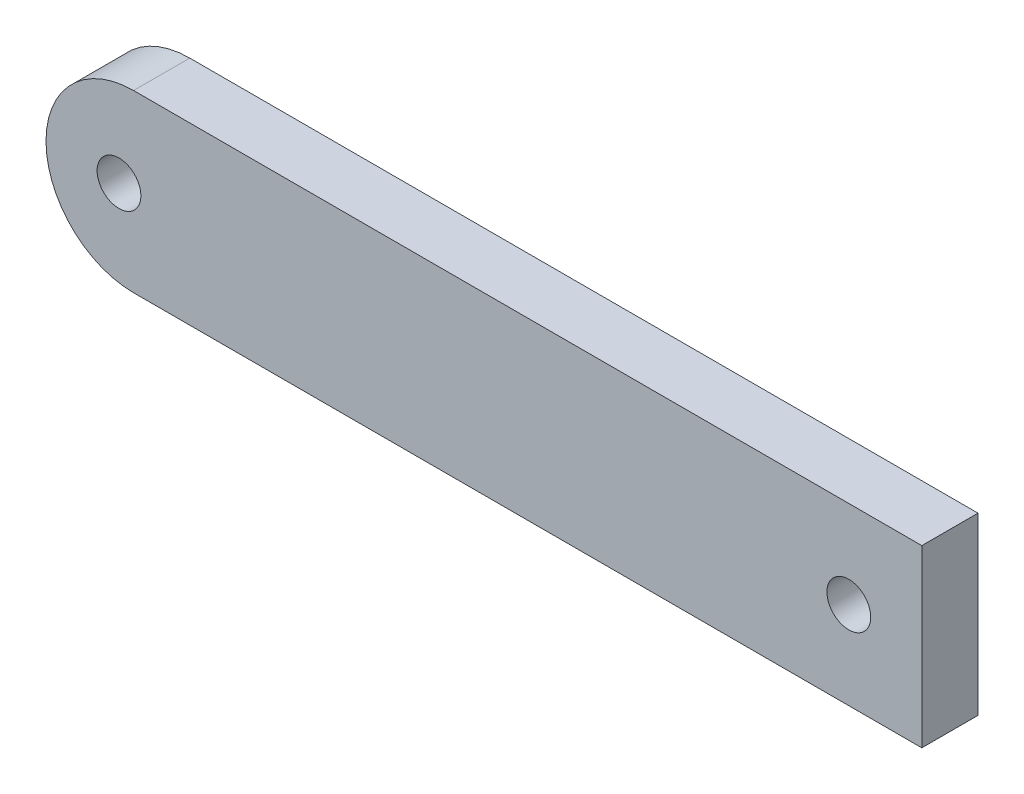
ISO-10303-21;
HEADER;
FILE_DESCRIPTION(('STEP AP214'),'2;1');
FILE_NAME('part.step','',(''),(''),'','','');
FILE_SCHEMA(('AUTOMOTIVE_DESIGN { 1 0 10303 214 1 1 1 1 }'));
ENDSEC;
DATA;
#1=APPLICATION_CONTEXT('core data for automotive mechanical design processes');
#2=APPLICATION_PROTOCOL_DEFINITION('international standard','automotive_design',2000,#1);
#3=PRODUCT_CONTEXT('',#1,'mechanical');
#4=PRODUCT('Part','Part','',(#3));
#5=PRODUCT_RELATED_PRODUCT_CATEGORY('part','',(#4));
#6=PRODUCT_DEFINITION_FORMATION('','',#4);
#7=PRODUCT_DEFINITION_CONTEXT('part definition',#1,'design');
#8=PRODUCT_DEFINITION('design','',#6,#7);
#9=PRODUCT_DEFINITION_SHAPE('','',#8);
#10=(LENGTH_UNIT() NAMED_UNIT(*) SI_UNIT(.MILLI.,.METRE.));
#11=(NAMED_UNIT(*) PLANE_ANGLE_UNIT() SI_UNIT($,.RADIAN.));
#12=(NAMED_UNIT(*) SI_UNIT($,.STERADIAN.) SOLID_ANGLE_UNIT());
#13=UNCERTAINTY_MEASURE_WITH_UNIT(LENGTH_MEASURE(1.E-05),#10,'distance_accuracy_value','');
#14=(GEOMETRIC_REPRESENTATION_CONTEXT(3) GLOBAL_UNCERTAINTY_ASSIGNED_CONTEXT((#13)) GLOBAL_UNIT_ASSIGNED_CONTEXT((#10,
#11,#12)) REPRESENTATION_CONTEXT('',''));
#15=CARTESIAN_POINT('',(0.,0.,0.));
#16=DIRECTION('',(0.,0.,1.));
#17=DIRECTION('',(1.,0.,0.));
#18=AXIS2_PLACEMENT_3D('',#15,#16,#17);
#19=CARTESIAN_POINT('',(0.,0.,3.85));
#20=DIRECTION('',(0.,0.,1.));
#21=DIRECTION('',(1.,0.,0.));
#22=AXIS2_PLACEMENT_3D('',#19,#20,#21);
#23=PLANE('',#22);
#24=CARTESIAN_POINT('',(-20.,0.,3.85));
#25=DIRECTION('',(0.,0.,1.));
#26=DIRECTION('',(1.,0.,0.));
#27=AXIS2_PLACEMENT_3D('',#24,#25,#26);
#28=CIRCLE('',#27,1.5);
#29=CARTESIAN_POINT('',(-21.5,0.,3.85));
#30=VERTEX_POINT('',#29);
#31=EDGE_CURVE('E128',#30,#30,#28,.T.);
#32=ORIENTED_EDGE('',*,*,#31,.F.);
#33=EDGE_LOOP('',(#32));
#34=FACE_BOUND('',#33,.T.);
#35=CARTESIAN_POINT('',(-19.,0.,3.85));
#36=DIRECTION('',(0.,0.,1.));
#37=DIRECTION('',(1.,0.,0.));
#38=AXIS2_PLACEMENT_3D('',#35,#36,#37);
#39=CIRCLE('',#38,6.);
#40=CARTESIAN_POINT('',(-19.,6.,3.85));
#41=VERTEX_POINT('',#40);
#42=CARTESIAN_POINT('',(-25.,0.,3.85));
#43=VERTEX_POINT('',#42);
#44=EDGE_CURVE('E67',#41,#43,#39,.T.);
#45=ORIENTED_EDGE('',*,*,#44,.T.);
#46=CARTESIAN_POINT('',(-19.,0.,3.85));
#47=DIRECTION('',(0.,0.,1.));
#48=DIRECTION('',(1.,0.,0.));
#49=AXIS2_PLACEMENT_3D('',#46,#47,#48);
#50=CIRCLE('',#49,6.);
#51=CARTESIAN_POINT('',(-19.,-6.,3.85));
#52=VERTEX_POINT('',#51);
#53=EDGE_CURVE('E55',#43,#52,#50,.T.);
#54=ORIENTED_EDGE('',*,*,#53,.T.);
#55=DIRECTION('',(1.,0.,0.));
#56=VECTOR('',#55,1.);
#57=CARTESIAN_POINT('',(35.,-6.,3.85));
#58=LINE('',#57,#56);
#59=CARTESIAN_POINT('',(35.,-6.,3.85));
#60=VERTEX_POINT('',#59);
#61=EDGE_CURVE('E92',#52,#60,#58,.T.);
#62=ORIENTED_EDGE('',*,*,#61,.T.);
#63=DIRECTION('',(0.,1.,0.));
#64=VECTOR('',#63,1.);
#65=CARTESIAN_POINT('',(35.,-6.,3.85));
#66=LINE('',#65,#64);
#67=CARTESIAN_POINT('',(35.,6.,3.85));
#68=VERTEX_POINT('',#67);
#69=EDGE_CURVE('E96',#60,#68,#66,.T.);
#70=ORIENTED_EDGE('',*,*,#69,.T.);
#71=DIRECTION('',(-1.,0.,0.));
#72=VECTOR('',#71,1.);
#73=CARTESIAN_POINT('',(35.,6.,3.85));
#74=LINE('',#73,#72);
#75=EDGE_CURVE('E119',#68,#41,#74,.T.);
#76=ORIENTED_EDGE('',*,*,#75,.T.);
#77=EDGE_LOOP('',(#45,#54,#62,#70,#76));
#78=FACE_BOUND('',#77,.T.);
#79=CARTESIAN_POINT('',(30.,0.,3.85));
#80=DIRECTION('',(0.,0.,1.));
#81=DIRECTION('',(1.,0.,0.));
#82=AXIS2_PLACEMENT_3D('',#79,#80,#81);
#83=CIRCLE('',#82,1.5);
#84=CARTESIAN_POINT('',(28.5,0.,3.85));
#85=VERTEX_POINT('',#84);
#86=EDGE_CURVE('E159',#85,#85,#83,.T.);
#87=ORIENTED_EDGE('',*,*,#86,.F.);
#88=EDGE_LOOP('',(#87));
#89=FACE_BOUND('',#88,.T.);
#90=ADVANCED_FACE('F45',(#34,#78,#89),#23,.T.);
#91=CARTESIAN_POINT('',(0.,0.,0.));
#92=DIRECTION('',(0.,0.,1.));
#93=DIRECTION('',(1.,0.,0.));
#94=AXIS2_PLACEMENT_3D('',#91,#92,#93);
#95=PLANE('',#94);
#96=DIRECTION('',(1.,0.,0.));
#97=VECTOR('',#96,1.);
#98=CARTESIAN_POINT('',(35.,-6.,0.));
#99=LINE('',#98,#97);
#100=CARTESIAN_POINT('',(-19.,-6.,0.));
#101=VERTEX_POINT('',#100);
#102=CARTESIAN_POINT('',(35.,-6.,0.));
#103=VERTEX_POINT('',#102);
#104=EDGE_CURVE('E109',#101,#103,#99,.T.);
#105=ORIENTED_EDGE('',*,*,#104,.F.);
#106=CARTESIAN_POINT('',(-19.,0.,0.));
#107=DIRECTION('',(0.,0.,1.));
#108=DIRECTION('',(1.,0.,0.));
#109=AXIS2_PLACEMENT_3D('',#106,#107,#108);
#110=CIRCLE('',#109,6.);
#111=CARTESIAN_POINT('',(-25.,0.,0.));
#112=VERTEX_POINT('',#111);
#113=EDGE_CURVE('E140',#101,#112,#110,.F.);
#114=ORIENTED_EDGE('',*,*,#113,.T.);
#115=CARTESIAN_POINT('',(-19.,0.,0.));
#116=DIRECTION('',(0.,0.,1.));
#117=DIRECTION('',(1.,0.,0.));
#118=AXIS2_PLACEMENT_3D('',#115,#116,#117);
#119=CIRCLE('',#118,6.);
#120=CARTESIAN_POINT('',(-19.,6.,0.));
#121=VERTEX_POINT('',#120);
#122=EDGE_CURVE('E137',#112,#121,#119,.F.);
#123=ORIENTED_EDGE('',*,*,#122,.T.);
#124=DIRECTION('',(-1.,0.,0.));
#125=VECTOR('',#124,1.);
#126=CARTESIAN_POINT('',(35.,6.,0.));
#127=LINE('',#126,#125);
#128=CARTESIAN_POINT('',(35.,6.,0.));
#129=VERTEX_POINT('',#128);
#130=EDGE_CURVE('E103',#129,#121,#127,.T.);
#131=ORIENTED_EDGE('',*,*,#130,.F.);
#132=DIRECTION('',(0.,1.,0.));
#133=VECTOR('',#132,1.);
#134=CARTESIAN_POINT('',(35.,-6.,0.));
#135=LINE('',#134,#133);
#136=EDGE_CURVE('E127',#103,#129,#135,.T.);
#137=ORIENTED_EDGE('',*,*,#136,.F.);
#138=EDGE_LOOP('',(#105,#114,#123,#131,#137));
#139=FACE_BOUND('',#138,.T.);
#140=CARTESIAN_POINT('',(-20.,0.,0.));
#141=DIRECTION('',(0.,0.,1.));
#142=DIRECTION('',(1.,0.,0.));
#143=AXIS2_PLACEMENT_3D('',#140,#141,#142);
#144=CIRCLE('',#143,1.5);
#145=CARTESIAN_POINT('',(-21.5,0.,0.));
#146=VERTEX_POINT('',#145);
#147=EDGE_CURVE('E165',#146,#146,#144,.T.);
#148=ORIENTED_EDGE('',*,*,#147,.T.);
#149=EDGE_LOOP('',(#148));
#150=FACE_BOUND('',#149,.T.);
#151=CARTESIAN_POINT('',(30.,0.,0.));
#152=DIRECTION('',(0.,0.,1.));
#153=DIRECTION('',(1.,0.,0.));
#154=AXIS2_PLACEMENT_3D('',#151,#152,#153);
#155=CIRCLE('',#154,1.5);
#156=CARTESIAN_POINT('',(28.5,0.,0.));
#157=VERTEX_POINT('',#156);
#158=EDGE_CURVE('E156',#157,#157,#155,.T.);
#159=ORIENTED_EDGE('',*,*,#158,.T.);
#160=EDGE_LOOP('',(#159));
#161=FACE_BOUND('',#160,.T.);
#162=ADVANCED_FACE('F148',(#139,#150,#161),#95,.F.);
#163=CARTESIAN_POINT('',(35.,-6.,3.85));
#164=DIRECTION('',(0.,1.,0.));
#165=DIRECTION('',(0.,0.,1.));
#166=AXIS2_PLACEMENT_3D('',#163,#164,#165);
#167=PLANE('',#166);
#168=ORIENTED_EDGE('',*,*,#61,.F.);
#169=DIRECTION('',(0.,0.,-1.));
#170=VECTOR('',#169,1.);
#171=CARTESIAN_POINT('',(-19.,-6.,3.85));
#172=LINE('',#171,#170);
#173=EDGE_CURVE('E113',#52,#101,#172,.T.);
#174=ORIENTED_EDGE('',*,*,#173,.T.);
#175=ORIENTED_EDGE('',*,*,#104,.T.);
#176=DIRECTION('',(0.,0.,-1.));
#177=VECTOR('',#176,1.);
#178=CARTESIAN_POINT('',(35.,-6.,3.85));
#179=LINE('',#178,#177);
#180=EDGE_CURVE('E106',#60,#103,#179,.T.);
#181=ORIENTED_EDGE('',*,*,#180,.F.);
#182=EDGE_LOOP('',(#168,#174,#175,#181));
#183=FACE_BOUND('',#182,.T.);
#184=ADVANCED_FACE('F107',(#183),#167,.F.);
#185=CARTESIAN_POINT('',(35.,-6.,3.85));
#186=DIRECTION('',(-1.,0.,0.));
#187=DIRECTION('',(0.,0.,1.));
#188=AXIS2_PLACEMENT_3D('',#185,#186,#187);
#189=PLANE('',#188);
#190=ORIENTED_EDGE('',*,*,#136,.T.);
#191=DIRECTION('',(0.,0.,-1.));
#192=VECTOR('',#191,1.);
#193=CARTESIAN_POINT('',(35.,6.,3.85));
#194=LINE('',#193,#192);
#195=EDGE_CURVE('E114',#68,#129,#194,.T.);
#196=ORIENTED_EDGE('',*,*,#195,.F.);
#197=ORIENTED_EDGE('',*,*,#69,.F.);
#198=ORIENTED_EDGE('',*,*,#180,.T.);
#199=EDGE_LOOP('',(#190,#196,#197,#198));
#200=FACE_BOUND('',#199,.T.);
#201=ADVANCED_FACE('F116',(#200),#189,.F.);
#202=CARTESIAN_POINT('',(35.,6.,3.85));
#203=DIRECTION('',(0.,-1.,0.));
#204=DIRECTION('',(0.,0.,-1.));
#205=AXIS2_PLACEMENT_3D('',#202,#203,#204);
#206=PLANE('',#205);
#207=ORIENTED_EDGE('',*,*,#130,.T.);
#208=DIRECTION('',(0.,0.,-1.));
#209=VECTOR('',#208,1.);
#210=CARTESIAN_POINT('',(-19.,6.,3.85));
#211=LINE('',#210,#209);
#212=EDGE_CURVE('E11',#121,#41,#211,.F.);
#213=ORIENTED_EDGE('',*,*,#212,.T.);
#214=ORIENTED_EDGE('',*,*,#75,.F.);
#215=ORIENTED_EDGE('',*,*,#195,.T.);
#216=EDGE_LOOP('',(#207,#213,#214,#215));
#217=FACE_BOUND('',#216,.T.);
#218=ADVANCED_FACE('F177',(#217),#206,.F.);
#219=CARTESIAN_POINT('',(-20.,0.,3.85));
#220=DIRECTION('',(0.,0.,-1.));
#221=DIRECTION('',(-1.,0.,0.));
#222=AXIS2_PLACEMENT_3D('',#219,#220,#221);
#223=CYLINDRICAL_SURFACE('',#222,1.5);
#224=CARTESIAN_POINT('',(-21.5,0.,3.85));
#225=CARTESIAN_POINT('',(-21.5,0.,3.80989583333333));
#226=CARTESIAN_POINT('',(-21.5,0.,3.76979166666667));
#227=CARTESIAN_POINT('',(-21.5,0.,3.68958333333333));
#228=CARTESIAN_POINT('',(-21.5,0.,3.64947916666667));
#229=CARTESIAN_POINT('',(-21.5,0.,3.56927083333333));
#230=CARTESIAN_POINT('',(-21.5,0.,3.52916666666667));
#231=CARTESIAN_POINT('',(-21.5,0.,3.44895833333333));
#232=CARTESIAN_POINT('',(-21.5,0.,3.40885416666667));
#233=CARTESIAN_POINT('',(-21.5,0.,3.32864583333333));
#234=CARTESIAN_POINT('',(-21.5,0.,3.28854166666667));
#235=CARTESIAN_POINT('',(-21.5,0.,3.20833333333333));
#236=CARTESIAN_POINT('',(-21.5,0.,3.16822916666667));
#237=CARTESIAN_POINT('',(-21.5,0.,3.08802083333333));
#238=CARTESIAN_POINT('',(-21.5,0.,3.04791666666667));
#239=CARTESIAN_POINT('',(-21.5,0.,2.96770833333333));
#240=CARTESIAN_POINT('',(-21.5,0.,2.92760416666667));
#241=CARTESIAN_POINT('',(-21.5,0.,2.84739583333333));
#242=CARTESIAN_POINT('',(-21.5,0.,2.80729166666667));
#243=CARTESIAN_POINT('',(-21.5,0.,2.72708333333333));
#244=CARTESIAN_POINT('',(-21.5,0.,2.68697916666667));
#245=CARTESIAN_POINT('',(-21.5,0.,2.60677083333333));
#246=CARTESIAN_POINT('',(-21.5,0.,2.56666666666667));
#247=CARTESIAN_POINT('',(-21.5,0.,2.48645833333333));
#248=CARTESIAN_POINT('',(-21.5,0.,2.44635416666667));
#249=CARTESIAN_POINT('',(-21.5,0.,2.36614583333333));
#250=CARTESIAN_POINT('',(-21.5,0.,2.32604166666667));
#251=CARTESIAN_POINT('',(-21.5,0.,2.24583333333333));
#252=CARTESIAN_POINT('',(-21.5,0.,2.20572916666667));
#253=CARTESIAN_POINT('',(-21.5,0.,2.12552083333333));
#254=CARTESIAN_POINT('',(-21.5,0.,2.08541666666667));
#255=CARTESIAN_POINT('',(-21.5,0.,2.00520833333333));
#256=CARTESIAN_POINT('',(-21.5,0.,1.96510416666667));
#257=CARTESIAN_POINT('',(-21.5,0.,1.88489583333333));
#258=CARTESIAN_POINT('',(-21.5,0.,1.84479166666667));
#259=CARTESIAN_POINT('',(-21.5,0.,1.76458333333333));
#260=CARTESIAN_POINT('',(-21.5,0.,1.72447916666667));
#261=CARTESIAN_POINT('',(-21.5,0.,1.64427083333333));
#262=CARTESIAN_POINT('',(-21.5,0.,1.60416666666667));
#263=CARTESIAN_POINT('',(-21.5,0.,1.52395833333333));
#264=CARTESIAN_POINT('',(-21.5,0.,1.48385416666667));
#265=CARTESIAN_POINT('',(-21.5,0.,1.40364583333333));
#266=CARTESIAN_POINT('',(-21.5,0.,1.36354166666667));
#267=CARTESIAN_POINT('',(-21.5,0.,1.28333333333333));
#268=CARTESIAN_POINT('',(-21.5,0.,1.24322916666667));
#269=CARTESIAN_POINT('',(-21.5,0.,1.16302083333333));
#270=CARTESIAN_POINT('',(-21.5,0.,1.12291666666667));
#271=CARTESIAN_POINT('',(-21.5,0.,1.04270833333333));
#272=CARTESIAN_POINT('',(-21.5,0.,1.00260416666667));
#273=CARTESIAN_POINT('',(-21.5,0.,0.922395833333333));
#274=CARTESIAN_POINT('',(-21.5,0.,0.882291666666666));
#275=CARTESIAN_POINT('',(-21.5,0.,0.802083333333333));
#276=CARTESIAN_POINT('',(-21.5,0.,0.761979166666666));
#277=CARTESIAN_POINT('',(-21.5,0.,0.681770833333333));
#278=CARTESIAN_POINT('',(-21.5,0.,0.641666666666666));
#279=CARTESIAN_POINT('',(-21.5,0.,0.561458333333333));
#280=CARTESIAN_POINT('',(-21.5,0.,0.521354166666666));
#281=CARTESIAN_POINT('',(-21.5,0.,0.441145833333333));
#282=CARTESIAN_POINT('',(-21.5,0.,0.401041666666666));
#283=CARTESIAN_POINT('',(-21.5,0.,0.320833333333333));
#284=CARTESIAN_POINT('',(-21.5,0.,0.280729166666666));
#285=CARTESIAN_POINT('',(-21.5,0.,0.200520833333333));
#286=CARTESIAN_POINT('',(-21.5,0.,0.160416666666666));
#287=CARTESIAN_POINT('',(-21.5,0.,0.080208333333333));
#288=CARTESIAN_POINT('',(-21.5,0.,0.0401041666666663));
#289=CARTESIAN_POINT('',(-21.5,0.,0.));
#290=B_SPLINE_CURVE_WITH_KNOTS('',3,(#224,#225,#226,#227,#228,#229,#230,#231,#232,#233,#234,
#235,#236,#237,#238,#239,#240,#241,#242,#243,#244,#245,#246,#247,#248,#249,#250,#251,#252,#253,
#254,#255,#256,#257,#258,#259,#260,#261,#262,#263,#264,#265,#266,#267,#268,#269,#270,#271,#272,
#273,#274,#275,#276,#277,#278,#279,#280,#281,#282,#283,#284,#285,#286,#287,#288,#289),
.UNSPECIFIED.,.F.,.F.,(4,2,2,2,2,2,2,2,2,2,2,2,2,2,2,2,2,2,2,2,2,2,2,2,2,2,2,2,2,2,2,2,4),(0.,
0.1203125,0.240625,0.3609375,0.48125,0.6015625,0.721875,0.842187500000001,0.9625,1.0828125,
1.203125,1.3234375,1.44375,1.5640625,1.684375,1.8046875,1.925,2.0453125,2.165625,2.2859375,
2.40625,2.5265625,2.646875,2.7671875,2.8875,3.0078125,3.128125,3.2484375,3.36875,3.4890625,
3.609375,3.7296875,3.85),.UNSPECIFIED.);
#291=EDGE_CURVE('BSEAM174',#30,#146,#290,.T.);
#292=ORIENTED_EDGE('',*,*,#31,.T.);
#293=ORIENTED_EDGE('',*,*,#147,.F.);
#294=ORIENTED_EDGE('',*,*,#291,.T.);
#295=ORIENTED_EDGE('',*,*,#291,.F.);
#296=EDGE_LOOP('',(#292,#294,#293,#295));
#297=FACE_BOUND('',#296,.T.);
#298=ADVANCED_FACE('F174',(#297),#223,.F.);
#299=CARTESIAN_POINT('',(30.,0.,3.85));
#300=DIRECTION('',(0.,0.,-1.));
#301=DIRECTION('',(-1.,0.,0.));
#302=AXIS2_PLACEMENT_3D('',#299,#300,#301);
#303=CYLINDRICAL_SURFACE('',#302,1.5);
#304=CARTESIAN_POINT('',(28.5,0.,3.85));
#305=CARTESIAN_POINT('',(28.5,0.,3.80989583333333));
#306=CARTESIAN_POINT('',(28.5,0.,3.76979166666667));
#307=CARTESIAN_POINT('',(28.5,0.,3.68958333333333));
#308=CARTESIAN_POINT('',(28.5,0.,3.64947916666667));
#309=CARTESIAN_POINT('',(28.5,0.,3.56927083333333));
#310=CARTESIAN_POINT('',(28.5,0.,3.52916666666667));
#311=CARTESIAN_POINT('',(28.5,0.,3.44895833333333));
#312=CARTESIAN_POINT('',(28.5,0.,3.40885416666667));
#313=CARTESIAN_POINT('',(28.5,0.,3.32864583333333));
#314=CARTESIAN_POINT('',(28.5,0.,3.28854166666667));
#315=CARTESIAN_POINT('',(28.5,0.,3.20833333333333));
#316=CARTESIAN_POINT('',(28.5,0.,3.16822916666667));
#317=CARTESIAN_POINT('',(28.5,0.,3.08802083333333));
#318=CARTESIAN_POINT('',(28.5,0.,3.04791666666667));
#319=CARTESIAN_POINT('',(28.5,0.,2.96770833333333));
#320=CARTESIAN_POINT('',(28.5,0.,2.92760416666667));
#321=CARTESIAN_POINT('',(28.5,0.,2.84739583333333));
#322=CARTESIAN_POINT('',(28.5,0.,2.80729166666667));
#323=CARTESIAN_POINT('',(28.5,0.,2.72708333333333));
#324=CARTESIAN_POINT('',(28.5,0.,2.68697916666667));
#325=CARTESIAN_POINT('',(28.5,0.,2.60677083333333));
#326=CARTESIAN_POINT('',(28.5,0.,2.56666666666667));
#327=CARTESIAN_POINT('',(28.5,0.,2.48645833333333));
#328=CARTESIAN_POINT('',(28.5,0.,2.44635416666667));
#329=CARTESIAN_POINT('',(28.5,0.,2.36614583333333));
#330=CARTESIAN_POINT('',(28.5,0.,2.32604166666667));
#331=CARTESIAN_POINT('',(28.5,0.,2.24583333333333));
#332=CARTESIAN_POINT('',(28.5,0.,2.20572916666667));
#333=CARTESIAN_POINT('',(28.5,0.,2.12552083333333));
#334=CARTESIAN_POINT('',(28.5,0.,2.08541666666667));
#335=CARTESIAN_POINT('',(28.5,0.,2.00520833333333));
#336=CARTESIAN_POINT('',(28.5,0.,1.96510416666667));
#337=CARTESIAN_POINT('',(28.5,0.,1.88489583333333));
#338=CARTESIAN_POINT('',(28.5,0.,1.84479166666667));
#339=CARTESIAN_POINT('',(28.5,0.,1.76458333333333));
#340=CARTESIAN_POINT('',(28.5,0.,1.72447916666667));
#341=CARTESIAN_POINT('',(28.5,0.,1.64427083333333));
#342=CARTESIAN_POINT('',(28.5,0.,1.60416666666667));
#343=CARTESIAN_POINT('',(28.5,0.,1.52395833333333));
#344=CARTESIAN_POINT('',(28.5,0.,1.48385416666667));
#345=CARTESIAN_POINT('',(28.5,0.,1.40364583333333));
#346=CARTESIAN_POINT('',(28.5,0.,1.36354166666667));
#347=CARTESIAN_POINT('',(28.5,0.,1.28333333333333));
#348=CARTESIAN_POINT('',(28.5,0.,1.24322916666667));
#349=CARTESIAN_POINT('',(28.5,0.,1.16302083333333));
#350=CARTESIAN_POINT('',(28.5,0.,1.12291666666667));
#351=CARTESIAN_POINT('',(28.5,0.,1.04270833333333));
#352=CARTESIAN_POINT('',(28.5,0.,1.00260416666667));
#353=CARTESIAN_POINT('',(28.5,0.,0.922395833333333));
#354=CARTESIAN_POINT('',(28.5,0.,0.882291666666666));
#355=CARTESIAN_POINT('',(28.5,0.,0.802083333333333));
#356=CARTESIAN_POINT('',(28.5,0.,0.761979166666666));
#357=CARTESIAN_POINT('',(28.5,0.,0.681770833333333));
#358=CARTESIAN_POINT('',(28.5,0.,0.641666666666666));
#359=CARTESIAN_POINT('',(28.5,0.,0.561458333333333));
#360=CARTESIAN_POINT('',(28.5,0.,0.521354166666666));
#361=CARTESIAN_POINT('',(28.5,0.,0.441145833333333));
#362=CARTESIAN_POINT('',(28.5,0.,0.401041666666666));
#363=CARTESIAN_POINT('',(28.5,0.,0.320833333333333));
#364=CARTESIAN_POINT('',(28.5,0.,0.280729166666666));
#365=CARTESIAN_POINT('',(28.5,0.,0.200520833333333));
#366=CARTESIAN_POINT('',(28.5,0.,0.160416666666666));
#367=CARTESIAN_POINT('',(28.5,0.,0.080208333333333));
#368=CARTESIAN_POINT('',(28.5,0.,0.0401041666666663));
#369=CARTESIAN_POINT('',(28.5,0.,0.));
#370=B_SPLINE_CURVE_WITH_KNOTS('',3,(#304,#305,#306,#307,#308,#309,#310,#311,#312,#313,#314,
#315,#316,#317,#318,#319,#320,#321,#322,#323,#324,#325,#326,#327,#328,#329,#330,#331,#332,#333,
#334,#335,#336,#337,#338,#339,#340,#341,#342,#343,#344,#345,#346,#347,#348,#349,#350,#351,#352,
#353,#354,#355,#356,#357,#358,#359,#360,#361,#362,#363,#364,#365,#366,#367,#368,#369),
.UNSPECIFIED.,.F.,.F.,(4,2,2,2,2,2,2,2,2,2,2,2,2,2,2,2,2,2,2,2,2,2,2,2,2,2,2,2,2,2,2,2,4),(0.,
0.1203125,0.240625,0.3609375,0.48125,0.6015625,0.721875,0.842187500000001,0.9625,1.0828125,
1.203125,1.3234375,1.44375,1.5640625,1.684375,1.8046875,1.925,2.0453125,2.165625,2.2859375,
2.40625,2.5265625,2.646875,2.7671875,2.8875,3.0078125,3.128125,3.2484375,3.36875,3.4890625,
3.609375,3.7296875,3.85),.UNSPECIFIED.);
#371=EDGE_CURVE('BSEAM176',#85,#157,#370,.T.);
#372=ORIENTED_EDGE('',*,*,#86,.T.);
#373=ORIENTED_EDGE('',*,*,#158,.F.);
#374=ORIENTED_EDGE('',*,*,#371,.T.);
#375=ORIENTED_EDGE('',*,*,#371,.F.);
#376=EDGE_LOOP('',(#372,#374,#373,#375));
#377=FACE_BOUND('',#376,.T.);
#378=ADVANCED_FACE('F176',(#377),#303,.F.);
#379=CARTESIAN_POINT('',(-19.,0.,3.85));
#380=DIRECTION('',(0.,0.,-1.));
#381=DIRECTION('',(-1.,0.,0.));
#382=AXIS2_PLACEMENT_3D('',#379,#380,#381);
#383=CYLINDRICAL_SURFACE('',#382,6.);
#384=DIRECTION('',(0.,0.,-1.));
#385=VECTOR('',#384,1.);
#386=CARTESIAN_POINT('',(-25.,0.,3.85));
#387=LINE('',#386,#385);
#388=EDGE_CURVE('E49',#43,#112,#387,.T.);
#389=ORIENTED_EDGE('',*,*,#388,.F.);
#390=ORIENTED_EDGE('',*,*,#44,.F.);
#391=ORIENTED_EDGE('',*,*,#212,.F.);
#392=ORIENTED_EDGE('',*,*,#122,.F.);
#393=EDGE_LOOP('',(#389,#390,#391,#392));
#394=FACE_BOUND('',#393,.T.);
#395=ADVANCED_FACE('F47',(#394),#383,.T.);
#396=CARTESIAN_POINT('',(-19.,0.,3.85));
#397=DIRECTION('',(0.,0.,-1.));
#398=DIRECTION('',(-1.,0.,0.));
#399=AXIS2_PLACEMENT_3D('',#396,#397,#398);
#400=CYLINDRICAL_SURFACE('',#399,6.);
#401=ORIENTED_EDGE('',*,*,#53,.F.);
#402=ORIENTED_EDGE('',*,*,#388,.T.);
#403=ORIENTED_EDGE('',*,*,#113,.F.);
#404=ORIENTED_EDGE('',*,*,#173,.F.);
#405=EDGE_LOOP('',(#401,#402,#403,#404));
#406=FACE_BOUND('',#405,.T.);
#407=ADVANCED_FACE('F154',(#406),#400,.T.);
#408=CLOSED_SHELL('',(#90,#162,#184,#201,#218,#298,#378,#395,#407));
#409=MANIFOLD_SOLID_BREP('B2',#408);
#410=ADVANCED_BREP_SHAPE_REPRESENTATION('',(#18,#409),#14);
#411=SHAPE_DEFINITION_REPRESENTATION(#9,#410);
ENDSEC;
END-ISO-10303-21;
